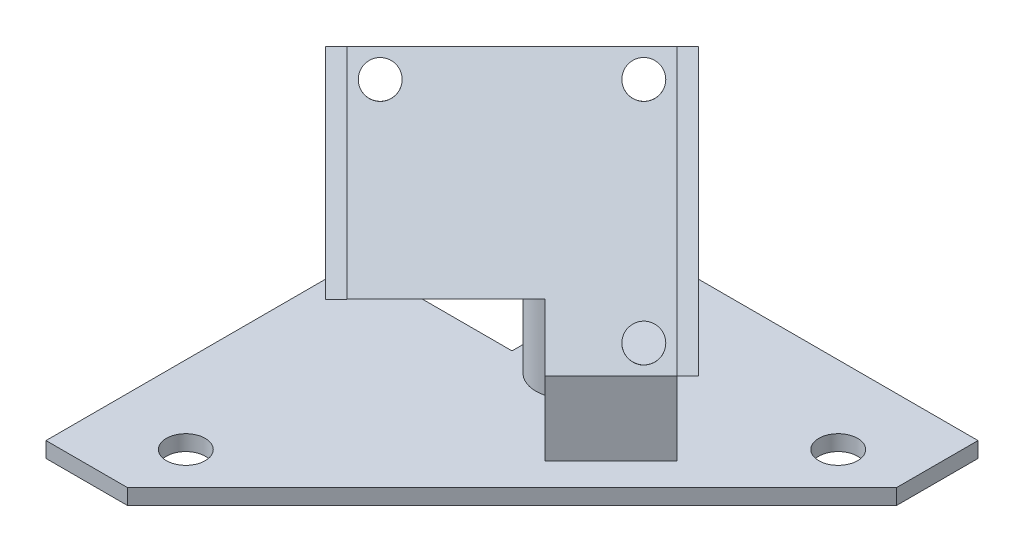
ISO-10303-21;
HEADER;
FILE_DESCRIPTION(('STEP AP214'),'2;1');
FILE_NAME('part.step','',(''),(''),'','','');
FILE_SCHEMA(('AUTOMOTIVE_DESIGN { 1 0 10303 214 1 1 1 1 }'));
ENDSEC;
DATA;
#1=APPLICATION_CONTEXT('core data for automotive mechanical design processes');
#2=APPLICATION_PROTOCOL_DEFINITION('international standard','automotive_design',2000,#1);
#3=PRODUCT_CONTEXT('',#1,'mechanical');
#4=PRODUCT('Part','Part','',(#3));
#5=PRODUCT_RELATED_PRODUCT_CATEGORY('part','',(#4));
#6=PRODUCT_DEFINITION_FORMATION('','',#4);
#7=PRODUCT_DEFINITION_CONTEXT('part definition',#1,'design');
#8=PRODUCT_DEFINITION('design','',#6,#7);
#9=PRODUCT_DEFINITION_SHAPE('','',#8);
#10=(LENGTH_UNIT() NAMED_UNIT(*) SI_UNIT(.MILLI.,.METRE.));
#11=(NAMED_UNIT(*) PLANE_ANGLE_UNIT() SI_UNIT($,.RADIAN.));
#12=(NAMED_UNIT(*) SI_UNIT($,.STERADIAN.) SOLID_ANGLE_UNIT());
#13=UNCERTAINTY_MEASURE_WITH_UNIT(LENGTH_MEASURE(1.E-05),#10,'distance_accuracy_value','');
#14=(GEOMETRIC_REPRESENTATION_CONTEXT(3) GLOBAL_UNCERTAINTY_ASSIGNED_CONTEXT((#13)) GLOBAL_UNIT_ASSIGNED_CONTEXT((#10,
#11,#12)) REPRESENTATION_CONTEXT('',''));
#15=CARTESIAN_POINT('',(0.,0.,0.));
#16=DIRECTION('',(0.,0.,1.));
#17=DIRECTION('',(1.,0.,0.));
#18=AXIS2_PLACEMENT_3D('',#15,#16,#17);
#19=CARTESIAN_POINT('',(36.083472955532,25.2282933289435,14.8702695199356));
#20=DIRECTION('',(-0.707106781186547,0.,0.707106781186548));
#21=DIRECTION('',(0.707106781186548,0.,0.707106781186547));
#22=AXIS2_PLACEMENT_3D('',#19,#20,#21);
#23=PLANE('',#22);
#24=DIRECTION('',(-0.57922796533957,-0.573576436351044,-0.57922796533957));
#25=VECTOR('',#24,1.);
#26=CARTESIAN_POINT('',(44.6292314178445,13.1987116803095,23.4160279822481));
#27=LINE('',#26,#25);
#28=CARTESIAN_POINT('',(42.8915475218258,11.4779823712564,21.6783440862294));
#29=VERTEX_POINT('',#28);
#30=CARTESIAN_POINT('',(41.7330915911467,10.3308294985543,20.5198881555502));
#31=VERTEX_POINT('',#30);
#32=EDGE_CURVE('E301',#29,#31,#27,.T.);
#33=ORIENTED_EDGE('',*,*,#32,.F.);
#34=DIRECTION('',(0.,-1.,0.));
#35=VECTOR('',#34,1.);
#36=CARTESIAN_POINT('',(42.8915475218258,500000.,21.6783440862294));
#37=LINE('',#36,#35);
#38=CARTESIAN_POINT('',(42.8915475218258,2.,21.6783440862294));
#39=VERTEX_POINT('',#38);
#40=EDGE_CURVE('E253',#29,#39,#37,.T.);
#41=ORIENTED_EDGE('',*,*,#40,.T.);
#42=DIRECTION('',(-0.707106781186548,0.,-0.707106781186548));
#43=VECTOR('',#42,1.);
#44=CARTESIAN_POINT('',(10.6066017177982,2.,-10.6066017177982));
#45=LINE('',#44,#43);
#46=CARTESIAN_POINT('',(41.7330915911467,2.,20.5198881555502));
#47=VERTEX_POINT('',#46);
#48=EDGE_CURVE('E258',#39,#47,#45,.T.);
#49=ORIENTED_EDGE('',*,*,#48,.T.);
#50=DIRECTION('',(0.,-1.,0.));
#51=VECTOR('',#50,1.);
#52=CARTESIAN_POINT('',(41.7330915911467,500000.,20.5198881555502));
#53=LINE('',#52,#51);
#54=EDGE_CURVE('E256',#31,#47,#53,.T.);
#55=ORIENTED_EDGE('',*,*,#54,.F.);
#56=EDGE_LOOP('',(#33,#41,#49,#55));
#57=FACE_BOUND('',#56,.T.);
#58=ADVANCED_FACE('F35',(#57),#23,.F.);
#59=CARTESIAN_POINT('',(0.,2.,0.));
#60=DIRECTION('',(0.,1.,0.));
#61=DIRECTION('',(0.,0.,1.));
#62=AXIS2_PLACEMENT_3D('',#59,#60,#61);
#63=PLANE('',#62);
#64=CARTESIAN_POINT('',(26.0301640550348,2.,18.9590962431693));
#65=DIRECTION('',(0.,1.,0.));
#66=DIRECTION('',(0.,0.,1.));
#67=AXIS2_PLACEMENT_3D('',#64,#65,#66);
#68=CIRCLE('',#67,4.);
#69=CARTESIAN_POINT('',(26.0301640550348,2.,22.9590962431693));
#70=VERTEX_POINT('',#69);
#71=EDGE_CURVE('E194',#70,#70,#68,.T.);
#72=ORIENTED_EDGE('',*,*,#71,.F.);
#73=EDGE_LOOP('',(#72));
#74=FACE_BOUND('',#73,.T.);
#75=CARTESIAN_POINT('',(52.,2.,10.));
#76=DIRECTION('',(0.,1.,0.));
#77=DIRECTION('',(0.,0.,1.));
#78=AXIS2_PLACEMENT_3D('',#75,#76,#77);
#79=CIRCLE('',#78,2.5);
#80=CARTESIAN_POINT('',(52.,2.,12.5));
#81=VERTEX_POINT('',#80);
#82=EDGE_CURVE('E162',#81,#81,#79,.T.);
#83=ORIENTED_EDGE('',*,*,#82,.F.);
#84=EDGE_LOOP('',(#83));
#85=FACE_BOUND('',#84,.T.);
#86=CARTESIAN_POINT('',(10.,2.,52.));
#87=DIRECTION('',(0.,1.,0.));
#88=DIRECTION('',(0.,0.,1.));
#89=AXIS2_PLACEMENT_3D('',#86,#87,#88);
#90=CIRCLE('',#89,2.5);
#91=CARTESIAN_POINT('',(10.,2.,54.5));
#92=VERTEX_POINT('',#91);
#93=EDGE_CURVE('E187',#92,#92,#90,.T.);
#94=ORIENTED_EDGE('',*,*,#93,.F.);
#95=EDGE_LOOP('',(#94));
#96=FACE_BOUND('',#95,.T.);
#97=DIRECTION('',(1.,0.,0.));
#98=VECTOR('',#97,1.);
#99=CARTESIAN_POINT('',(0.,2.,0.));
#100=LINE('',#99,#98);
#101=CARTESIAN_POINT('',(20.,2.,0.));
#102=VERTEX_POINT('',#101);
#103=CARTESIAN_POINT('',(60.,2.,0.));
#104=VERTEX_POINT('',#103);
#105=EDGE_CURVE('E183',#102,#104,#100,.T.);
#106=ORIENTED_EDGE('',*,*,#105,.F.);
#107=DIRECTION('',(0.,0.,1.));
#108=VECTOR('',#107,1.);
#109=CARTESIAN_POINT('',(20.,2.,0.));
#110=LINE('',#109,#108);
#111=CARTESIAN_POINT('',(20.,2.,20.));
#112=VERTEX_POINT('',#111);
#113=EDGE_CURVE('E181',#102,#112,#110,.T.);
#114=ORIENTED_EDGE('',*,*,#113,.T.);
#115=DIRECTION('',(1.,0.,0.));
#116=VECTOR('',#115,1.);
#117=CARTESIAN_POINT('',(0.,2.,20.));
#118=LINE('',#117,#116);
#119=CARTESIAN_POINT('',(0.,2.,20.));
#120=VERTEX_POINT('',#119);
#121=EDGE_CURVE('E172',#120,#112,#118,.T.);
#122=ORIENTED_EDGE('',*,*,#121,.F.);
#123=DIRECTION('',(0.,0.,1.));
#124=VECTOR('',#123,1.);
#125=CARTESIAN_POINT('',(0.,2.,0.));
#126=LINE('',#125,#124);
#127=CARTESIAN_POINT('',(0.,2.,60.));
#128=VERTEX_POINT('',#127);
#129=EDGE_CURVE('E117',#120,#128,#126,.T.);
#130=ORIENTED_EDGE('',*,*,#129,.T.);
#131=DIRECTION('',(1.,0.,0.));
#132=VECTOR('',#131,1.);
#133=CARTESIAN_POINT('',(0.,2.,60.));
#134=LINE('',#133,#132);
#135=CARTESIAN_POINT('',(10.5025253169417,2.,60.));
#136=VERTEX_POINT('',#135);
#137=EDGE_CURVE('E107',#128,#136,#134,.T.);
#138=ORIENTED_EDGE('',*,*,#137,.T.);
#139=DIRECTION('',(-0.707106781186548,0.,0.707106781186548));
#140=VECTOR('',#139,1.);
#141=CARTESIAN_POINT('',(35.2512626584708,2.,35.2512626584708));
#142=LINE('',#141,#140);
#143=CARTESIAN_POINT('',(60.,2.,10.5025253169417));
#144=VERTEX_POINT('',#143);
#145=EDGE_CURVE('E114',#144,#136,#142,.T.);
#146=ORIENTED_EDGE('',*,*,#145,.F.);
#147=DIRECTION('',(0.,0.,1.));
#148=VECTOR('',#147,1.);
#149=CARTESIAN_POINT('',(60.,2.,0.));
#150=LINE('',#149,#148);
#151=EDGE_CURVE('E133',#104,#144,#150,.T.);
#152=ORIENTED_EDGE('',*,*,#151,.F.);
#153=EDGE_LOOP('',(#106,#114,#122,#130,#138,#146,#152));
#154=FACE_BOUND('',#153,.T.);
#155=DIRECTION('',(-0.707106781186548,0.,0.707106781186547));
#156=VECTOR('',#155,1.);
#157=CARTESIAN_POINT('',(31.1264898733485,2.,31.1264898733485));
#158=LINE('',#157,#156);
#159=CARTESIAN_POINT('',(33.2478102169081,2.,29.0051695297888));
#160=VERTEX_POINT('',#159);
#161=EDGE_CURVE('E50',#47,#160,#158,.T.);
#162=ORIENTED_EDGE('',*,*,#161,.F.);
#163=ORIENTED_EDGE('',*,*,#48,.F.);
#164=DIRECTION('',(0.707106781186548,0.,-0.707106781186547));
#165=VECTOR('',#164,1.);
#166=CARTESIAN_POINT('',(32.2849458040276,2.,32.2849458040276));
#167=LINE('',#166,#165);
#168=CARTESIAN_POINT('',(34.4062661475873,2.,30.163625460468));
#169=VERTEX_POINT('',#168);
#170=EDGE_CURVE('E261',#169,#39,#167,.T.);
#171=ORIENTED_EDGE('',*,*,#170,.F.);
#172=DIRECTION('',(0.707106781186548,0.,0.707106781186548));
#173=VECTOR('',#172,1.);
#174=CARTESIAN_POINT('',(2.12132034355965,2.,-2.12132034355965));
#175=LINE('',#174,#173);
#176=EDGE_CURVE('E264',#160,#169,#175,.T.);
#177=ORIENTED_EDGE('',*,*,#176,.F.);
#178=EDGE_LOOP('',(#162,#163,#171,#177));
#179=FACE_BOUND('',#178,.T.);
#180=ADVANCED_FACE('F110',(#74,#85,#96,#154,#179),#63,.T.);
#181=CARTESIAN_POINT('',(0.,2.,0.));
#182=DIRECTION('',(0.,0.,-1.));
#183=DIRECTION('',(-1.,0.,0.));
#184=AXIS2_PLACEMENT_3D('',#181,#182,#183);
#185=PLANE('',#184);
#186=DIRECTION('',(1.,0.,0.));
#187=VECTOR('',#186,1.);
#188=CARTESIAN_POINT('',(0.,0.,0.));
#189=LINE('',#188,#187);
#190=CARTESIAN_POINT('',(20.,0.,0.));
#191=VERTEX_POINT('',#190);
#192=CARTESIAN_POINT('',(60.,0.,0.));
#193=VERTEX_POINT('',#192);
#194=EDGE_CURVE('E145',#191,#193,#189,.T.);
#195=ORIENTED_EDGE('',*,*,#194,.F.);
#196=DIRECTION('',(0.,-1.,0.));
#197=VECTOR('',#196,1.);
#198=CARTESIAN_POINT('',(20.,2.,0.));
#199=LINE('',#198,#197);
#200=EDGE_CURVE('E11',#102,#191,#199,.T.);
#201=ORIENTED_EDGE('',*,*,#200,.F.);
#202=ORIENTED_EDGE('',*,*,#105,.T.);
#203=DIRECTION('',(0.,-1.,0.));
#204=VECTOR('',#203,1.);
#205=CARTESIAN_POINT('',(60.,2.,0.));
#206=LINE('',#205,#204);
#207=EDGE_CURVE('E59',#104,#193,#206,.T.);
#208=ORIENTED_EDGE('',*,*,#207,.T.);
#209=EDGE_LOOP('',(#195,#201,#202,#208));
#210=FACE_BOUND('',#209,.T.);
#211=ADVANCED_FACE('F434',(#210),#185,.T.);
#212=CARTESIAN_POINT('',(20.,2.,0.));
#213=DIRECTION('',(1.,0.,0.));
#214=DIRECTION('',(0.,0.,-1.));
#215=AXIS2_PLACEMENT_3D('',#212,#213,#214);
#216=PLANE('',#215);
#217=DIRECTION('',(0.,0.,1.));
#218=VECTOR('',#217,1.);
#219=CARTESIAN_POINT('',(20.,0.,0.));
#220=LINE('',#219,#218);
#221=CARTESIAN_POINT('',(20.,0.,20.));
#222=VERTEX_POINT('',#221);
#223=EDGE_CURVE('E147',#191,#222,#220,.T.);
#224=ORIENTED_EDGE('',*,*,#223,.T.);
#225=DIRECTION('',(0.,-1.,0.));
#226=VECTOR('',#225,1.);
#227=CARTESIAN_POINT('',(20.,2.,20.));
#228=LINE('',#227,#226);
#229=EDGE_CURVE('E43',#112,#222,#228,.T.);
#230=ORIENTED_EDGE('',*,*,#229,.F.);
#231=ORIENTED_EDGE('',*,*,#113,.F.);
#232=ORIENTED_EDGE('',*,*,#200,.T.);
#233=EDGE_LOOP('',(#224,#230,#231,#232));
#234=FACE_BOUND('',#233,.T.);
#235=ADVANCED_FACE('F175',(#234),#216,.F.);
#236=CARTESIAN_POINT('',(0.,2.,20.));
#237=DIRECTION('',(0.,0.,-1.));
#238=DIRECTION('',(-1.,0.,0.));
#239=AXIS2_PLACEMENT_3D('',#236,#237,#238);
#240=PLANE('',#239);
#241=DIRECTION('',(1.,0.,0.));
#242=VECTOR('',#241,1.);
#243=CARTESIAN_POINT('',(0.,0.,20.));
#244=LINE('',#243,#242);
#245=CARTESIAN_POINT('',(0.,0.,20.));
#246=VERTEX_POINT('',#245);
#247=EDGE_CURVE('E150',#246,#222,#244,.T.);
#248=ORIENTED_EDGE('',*,*,#247,.F.);
#249=DIRECTION('',(0.,-1.,0.));
#250=VECTOR('',#249,1.);
#251=CARTESIAN_POINT('',(0.,2.,20.));
#252=LINE('',#251,#250);
#253=EDGE_CURVE('E166',#120,#246,#252,.T.);
#254=ORIENTED_EDGE('',*,*,#253,.F.);
#255=ORIENTED_EDGE('',*,*,#121,.T.);
#256=ORIENTED_EDGE('',*,*,#229,.T.);
#257=EDGE_LOOP('',(#248,#254,#255,#256));
#258=FACE_BOUND('',#257,.T.);
#259=ADVANCED_FACE('F171',(#258),#240,.T.);
#260=CARTESIAN_POINT('',(0.,2.,0.));
#261=DIRECTION('',(1.,0.,0.));
#262=DIRECTION('',(0.,0.,-1.));
#263=AXIS2_PLACEMENT_3D('',#260,#261,#262);
#264=PLANE('',#263);
#265=DIRECTION('',(0.,0.,1.));
#266=VECTOR('',#265,1.);
#267=CARTESIAN_POINT('',(0.,0.,0.));
#268=LINE('',#267,#266);
#269=CARTESIAN_POINT('',(0.,0.,60.));
#270=VERTEX_POINT('',#269);
#271=EDGE_CURVE('E153',#246,#270,#268,.T.);
#272=ORIENTED_EDGE('',*,*,#271,.T.);
#273=DIRECTION('',(0.,-1.,0.));
#274=VECTOR('',#273,1.);
#275=CARTESIAN_POINT('',(0.,2.,60.));
#276=LINE('',#275,#274);
#277=EDGE_CURVE('E129',#128,#270,#276,.T.);
#278=ORIENTED_EDGE('',*,*,#277,.F.);
#279=ORIENTED_EDGE('',*,*,#129,.F.);
#280=ORIENTED_EDGE('',*,*,#253,.T.);
#281=EDGE_LOOP('',(#272,#278,#279,#280));
#282=FACE_BOUND('',#281,.T.);
#283=ADVANCED_FACE('F180',(#282),#264,.F.);
#284=CARTESIAN_POINT('',(0.,2.,60.));
#285=DIRECTION('',(0.,0.,-1.));
#286=DIRECTION('',(-1.,0.,0.));
#287=AXIS2_PLACEMENT_3D('',#284,#285,#286);
#288=PLANE('',#287);
#289=DIRECTION('',(1.,0.,0.));
#290=VECTOR('',#289,1.);
#291=CARTESIAN_POINT('',(0.,0.,60.));
#292=LINE('',#291,#290);
#293=CARTESIAN_POINT('',(10.5025253169417,0.,60.));
#294=VERTEX_POINT('',#293);
#295=EDGE_CURVE('E125',#270,#294,#292,.T.);
#296=ORIENTED_EDGE('',*,*,#295,.T.);
#297=DIRECTION('',(0.,-1.,0.));
#298=VECTOR('',#297,1.);
#299=CARTESIAN_POINT('',(10.5025253169417,2.,60.));
#300=LINE('',#299,#298);
#301=EDGE_CURVE('E123',#136,#294,#300,.T.);
#302=ORIENTED_EDGE('',*,*,#301,.F.);
#303=ORIENTED_EDGE('',*,*,#137,.F.);
#304=ORIENTED_EDGE('',*,*,#277,.T.);
#305=EDGE_LOOP('',(#296,#302,#303,#304));
#306=FACE_BOUND('',#305,.T.);
#307=ADVANCED_FACE('F124',(#306),#288,.F.);
#308=CARTESIAN_POINT('',(35.2512626584708,2.,35.2512626584708));
#309=DIRECTION('',(0.707106781186547,0.,0.707106781186547));
#310=DIRECTION('',(0.707106781186548,0.,-0.707106781186548));
#311=AXIS2_PLACEMENT_3D('',#308,#309,#310);
#312=PLANE('',#311);
#313=DIRECTION('',(-0.707106781186548,0.,0.707106781186548));
#314=VECTOR('',#313,1.);
#315=CARTESIAN_POINT('',(35.2512626584708,0.,35.2512626584708));
#316=LINE('',#315,#314);
#317=CARTESIAN_POINT('',(60.,0.,10.5025253169417));
#318=VERTEX_POINT('',#317);
#319=EDGE_CURVE('E157',#318,#294,#316,.T.);
#320=ORIENTED_EDGE('',*,*,#319,.F.);
#321=DIRECTION('',(0.,-1.,0.));
#322=VECTOR('',#321,1.);
#323=CARTESIAN_POINT('',(60.,2.,10.5025253169417));
#324=LINE('',#323,#322);
#325=EDGE_CURVE('E130',#144,#318,#324,.T.);
#326=ORIENTED_EDGE('',*,*,#325,.F.);
#327=ORIENTED_EDGE('',*,*,#145,.T.);
#328=ORIENTED_EDGE('',*,*,#301,.T.);
#329=EDGE_LOOP('',(#320,#326,#327,#328));
#330=FACE_BOUND('',#329,.T.);
#331=ADVANCED_FACE('F132',(#330),#312,.T.);
#332=CARTESIAN_POINT('',(10.,2.,52.));
#333=DIRECTION('',(0.,-1.,0.));
#334=DIRECTION('',(0.,0.,-1.));
#335=AXIS2_PLACEMENT_3D('',#332,#333,#334);
#336=CYLINDRICAL_SURFACE('',#335,2.5);
#337=ORIENTED_EDGE('',*,*,#93,.T.);
#338=EDGE_LOOP('',(#337));
#339=FACE_BOUND('',#338,.T.);
#340=CARTESIAN_POINT('',(10.,0.,52.));
#341=DIRECTION('',(0.,1.,0.));
#342=DIRECTION('',(0.,0.,1.));
#343=AXIS2_PLACEMENT_3D('',#340,#341,#342);
#344=CIRCLE('',#343,2.5);
#345=CARTESIAN_POINT('',(10.,0.,54.5));
#346=VERTEX_POINT('',#345);
#347=EDGE_CURVE('E141',#346,#346,#344,.T.);
#348=ORIENTED_EDGE('',*,*,#347,.F.);
#349=EDGE_LOOP('',(#348));
#350=FACE_BOUND('',#349,.T.);
#351=ADVANCED_FACE('F457',(#339,#350),#336,.F.);
#352=CARTESIAN_POINT('',(52.,2.,10.));
#353=DIRECTION('',(0.,-1.,0.));
#354=DIRECTION('',(0.,0.,-1.));
#355=AXIS2_PLACEMENT_3D('',#352,#353,#354);
#356=CYLINDRICAL_SURFACE('',#355,2.5);
#357=ORIENTED_EDGE('',*,*,#82,.T.);
#358=EDGE_LOOP('',(#357));
#359=FACE_BOUND('',#358,.T.);
#360=CARTESIAN_POINT('',(52.,0.,10.));
#361=DIRECTION('',(0.,1.,0.));
#362=DIRECTION('',(0.,0.,1.));
#363=AXIS2_PLACEMENT_3D('',#360,#361,#362);
#364=CIRCLE('',#363,2.5);
#365=CARTESIAN_POINT('',(52.,0.,12.5));
#366=VERTEX_POINT('',#365);
#367=EDGE_CURVE('E138',#366,#366,#364,.T.);
#368=ORIENTED_EDGE('',*,*,#367,.F.);
#369=EDGE_LOOP('',(#368));
#370=FACE_BOUND('',#369,.T.);
#371=ADVANCED_FACE('F37',(#359,#370),#356,.F.);
#372=CARTESIAN_POINT('',(60.,2.,0.));
#373=DIRECTION('',(1.,0.,0.));
#374=DIRECTION('',(0.,0.,-1.));
#375=AXIS2_PLACEMENT_3D('',#372,#373,#374);
#376=PLANE('',#375);
#377=DIRECTION('',(0.,0.,1.));
#378=VECTOR('',#377,1.);
#379=CARTESIAN_POINT('',(60.,0.,0.));
#380=LINE('',#379,#378);
#381=EDGE_CURVE('E159',#193,#318,#380,.T.);
#382=ORIENTED_EDGE('',*,*,#381,.F.);
#383=ORIENTED_EDGE('',*,*,#207,.F.);
#384=ORIENTED_EDGE('',*,*,#151,.T.);
#385=ORIENTED_EDGE('',*,*,#325,.T.);
#386=EDGE_LOOP('',(#382,#383,#384,#385));
#387=FACE_BOUND('',#386,.T.);
#388=ADVANCED_FACE('F451',(#387),#376,.T.);
#389=CARTESIAN_POINT('',(0.,0.,0.));
#390=DIRECTION('',(0.,1.,0.));
#391=DIRECTION('',(0.,0.,1.));
#392=AXIS2_PLACEMENT_3D('',#389,#390,#391);
#393=PLANE('',#392);
#394=ORIENTED_EDGE('',*,*,#367,.T.);
#395=EDGE_LOOP('',(#394));
#396=FACE_BOUND('',#395,.T.);
#397=ORIENTED_EDGE('',*,*,#347,.T.);
#398=EDGE_LOOP('',(#397));
#399=FACE_BOUND('',#398,.T.);
#400=ORIENTED_EDGE('',*,*,#194,.T.);
#401=ORIENTED_EDGE('',*,*,#381,.T.);
#402=ORIENTED_EDGE('',*,*,#319,.T.);
#403=ORIENTED_EDGE('',*,*,#295,.F.);
#404=ORIENTED_EDGE('',*,*,#271,.F.);
#405=ORIENTED_EDGE('',*,*,#247,.T.);
#406=ORIENTED_EDGE('',*,*,#223,.F.);
#407=EDGE_LOOP('',(#400,#401,#402,#403,#404,#405,#406));
#408=FACE_BOUND('',#407,.T.);
#409=ADVANCED_FACE('F178',(#396,#399,#408),#393,.F.);
#410=CARTESIAN_POINT('',(26.0301640550348,43.283929457579,18.9590962431693));
#411=DIRECTION('',(0.,-1.,0.));
#412=DIRECTION('',(0.,0.,-1.));
#413=AXIS2_PLACEMENT_3D('',#410,#411,#412);
#414=CYLINDRICAL_SURFACE('',#413,4.);
#415=ORIENTED_EDGE('',*,*,#71,.T.);
#416=EDGE_LOOP('',(#415));
#417=FACE_BOUND('',#416,.T.);
#418=CARTESIAN_POINT('',(26.0301640550348,27.7646507935135,18.9590962431693));
#419=DIRECTION('',(0.57922796533957,0.573576436351044,0.57922796533957));
#420=DIRECTION('',(0.405579787672638,-0.819152044288993,0.405579787672638));
#421=AXIS2_PLACEMENT_3D('',#418,#419,#420);
#422=ELLIPSE('',#421,6.97378718248442,4.);
#423=CARTESIAN_POINT('',(28.858591179781,22.052058766545,21.7875233679155));
#424=VERTEX_POINT('',#423);
#425=EDGE_CURVE('E142',#424,#424,#422,.T.);
#426=ORIENTED_EDGE('',*,*,#425,.F.);
#427=EDGE_LOOP('',(#426));
#428=FACE_BOUND('',#427,.T.);
#429=ADVANCED_FACE('F447',(#417,#428),#414,.T.);
#430=CARTESIAN_POINT('',(27.5981915812934,25.2282933289435,23.3555508941741));
#431=DIRECTION('',(-0.707106781186547,0.,0.707106781186548));
#432=DIRECTION('',(0.707106781186548,0.,0.707106781186547));
#433=AXIS2_PLACEMENT_3D('',#430,#431,#432);
#434=PLANE('',#433);
#435=DIRECTION('',(-0.405579787672638,0.819152044288993,-0.405579787672637));
#436=VECTOR('',#435,1.);
#437=CARTESIAN_POINT('',(26.4397356506143,24.0811404562414,22.197094963495));
#438=LINE('',#437,#436);
#439=CARTESIAN_POINT('',(33.2478102169109,10.3308294985653,29.0051695297916));
#440=VERTEX_POINT('',#439);
#441=CARTESIAN_POINT('',(30.4087517031996,16.0648938085772,26.1661110160803));
#442=VERTEX_POINT('',#441);
#443=EDGE_CURVE('E217',#440,#442,#438,.T.);
#444=ORIENTED_EDGE('',*,*,#443,.F.);
#445=DIRECTION('',(0.,-1.,0.));
#446=VECTOR('',#445,1.);
#447=CARTESIAN_POINT('',(33.2478102169081,500000.,29.0051695297888));
#448=LINE('',#447,#446);
#449=EDGE_CURVE('E223',#440,#160,#448,.T.);
#450=ORIENTED_EDGE('',*,*,#449,.T.);
#451=ORIENTED_EDGE('',*,*,#176,.T.);
#452=DIRECTION('',(0.,-1.,0.));
#453=VECTOR('',#452,1.);
#454=CARTESIAN_POINT('',(34.4062661475873,500000.,30.163625460468));
#455=LINE('',#454,#453);
#456=CARTESIAN_POINT('',(34.4062661475873,11.4779823712564,30.163625460468));
#457=VERTEX_POINT('',#456);
#458=EDGE_CURVE('E250',#457,#169,#455,.T.);
#459=ORIENTED_EDGE('',*,*,#458,.F.);
#460=DIRECTION('',(-0.405579787672638,0.819152044288993,-0.405579787672637));
#461=VECTOR('',#460,1.);
#462=CARTESIAN_POINT('',(27.5981915812934,25.2282933289435,23.3555508941741));
#463=LINE('',#462,#461);
#464=CARTESIAN_POINT('',(31.5672076338788,17.2120466812793,27.3245669467595));
#465=VERTEX_POINT('',#464);
#466=EDGE_CURVE('E244',#457,#465,#463,.T.);
#467=ORIENTED_EDGE('',*,*,#466,.T.);
#468=DIRECTION('',(-0.57922796533957,-0.573576436351044,-0.57922796533957));
#469=VECTOR('',#468,1.);
#470=CARTESIAN_POINT('',(31.5672076338788,17.2120466812793,27.3245669467595));
#471=LINE('',#470,#469);
#472=EDGE_CURVE('E197',#465,#442,#471,.T.);
#473=ORIENTED_EDGE('',*,*,#472,.T.);
#474=EDGE_LOOP('',(#444,#450,#451,#459,#467,#473));
#475=FACE_BOUND('',#474,.T.);
#476=ADVANCED_FACE('F402',(#475),#434,.T.);
#477=CARTESIAN_POINT('',(20.1175521738485,36.0525436999262,20.1175521738485));
#478=DIRECTION('',(0.405579787672638,-0.819152044288993,0.405579787672638));
#479=DIRECTION('',(0.896169137511728,0.443712606279656,0.));
#480=AXIS2_PLACEMENT_3D('',#477,#478,#479);
#481=PLANE('',#480);
#482=DIRECTION('',(-0.707106781186547,0.,0.707106781186548));
#483=VECTOR('',#482,1.);
#484=CARTESIAN_POINT('',(18.9590962431693,34.9053908272241,18.9590962431693));
#485=LINE('',#484,#483);
#486=CARTESIAN_POINT('',(30.9799115233406,34.9053908272241,6.93828096299802));
#487=VERTEX_POINT('',#486);
#488=CARTESIAN_POINT('',(6.93828096299803,34.9053908272241,30.9799115233406));
#489=VERTEX_POINT('',#488);
#490=EDGE_CURVE('E211',#487,#489,#485,.T.);
#491=ORIENTED_EDGE('',*,*,#490,.T.);
#492=DIRECTION('',(-0.57922796533957,-0.573576436351044,-0.57922796533957));
#493=VECTOR('',#492,1.);
#494=CARTESIAN_POINT('',(9.83442078969587,37.7732730089793,33.8760513500385));
#495=LINE('',#494,#493);
#496=CARTESIAN_POINT('',(9.83442078969587,37.7732730089793,33.8760513500385));
#497=VERTEX_POINT('',#496);
#498=EDGE_CURVE('E268',#497,#489,#495,.T.);
#499=ORIENTED_EDGE('',*,*,#498,.F.);
#500=DIRECTION('',(-0.707106781186548,0.,0.707106781186548));
#501=VECTOR('',#500,1.);
#502=CARTESIAN_POINT('',(11.248634352069,37.7732730089793,32.4618377876654));
#503=LINE('',#502,#501);
#504=CARTESIAN_POINT('',(11.248634352069,37.7732730089793,32.4618377876654));
#505=VERTEX_POINT('',#504);
#506=EDGE_CURVE('E289',#505,#497,#503,.T.);
#507=ORIENTED_EDGE('',*,*,#506,.F.);
#508=DIRECTION('',(-0.57922796533957,-0.573576436351044,-0.57922796533957));
#509=VECTOR('',#508,1.);
#510=CARTESIAN_POINT('',(11.248634352069,37.7732730089793,32.4618377876654));
#511=LINE('',#510,#509);
#512=CARTESIAN_POINT('',(9.51095045605027,36.0525436999262,30.7241538916467));
#513=VERTEX_POINT('',#512);
#514=EDGE_CURVE('E277',#505,#513,#511,.T.);
#515=ORIENTED_EDGE('',*,*,#514,.T.);
#516=DIRECTION('',(-0.707106781186547,0.,0.707106781186548));
#517=VECTOR('',#516,1.);
#518=CARTESIAN_POINT('',(20.1175521738485,36.0525436999262,20.1175521738485));
#519=LINE('',#518,#517);
#520=CARTESIAN_POINT('',(30.7241538916467,36.0525436999262,9.51095045605025));
#521=VERTEX_POINT('',#520);
#522=EDGE_CURVE('E235',#521,#513,#519,.T.);
#523=ORIENTED_EDGE('',*,*,#522,.F.);
#524=DIRECTION('',(-0.57922796533957,-0.573576436351044,-0.57922796533957));
#525=VECTOR('',#524,1.);
#526=CARTESIAN_POINT('',(32.4618377876654,37.7732730089793,11.248634352069));
#527=LINE('',#526,#525);
#528=CARTESIAN_POINT('',(32.4618377876654,37.7732730089793,11.248634352069));
#529=VERTEX_POINT('',#528);
#530=EDGE_CURVE('E295',#529,#521,#527,.T.);
#531=ORIENTED_EDGE('',*,*,#530,.F.);
#532=DIRECTION('',(-0.707106781186546,0.,0.707106781186549));
#533=VECTOR('',#532,1.);
#534=CARTESIAN_POINT('',(32.4618377876654,37.7732730089793,11.248634352069));
#535=LINE('',#534,#533);
#536=CARTESIAN_POINT('',(33.8760513500385,37.7732730089793,9.83442078969586));
#537=VERTEX_POINT('',#536);
#538=EDGE_CURVE('E317',#537,#529,#535,.T.);
#539=ORIENTED_EDGE('',*,*,#538,.F.);
#540=DIRECTION('',(-0.57922796533957,-0.573576436351044,-0.57922796533957));
#541=VECTOR('',#540,1.);
#542=CARTESIAN_POINT('',(33.8760513500385,37.7732730089793,9.83442078969586));
#543=LINE('',#542,#541);
#544=EDGE_CURVE('E305',#537,#487,#543,.T.);
#545=ORIENTED_EDGE('',*,*,#544,.T.);
#546=EDGE_LOOP('',(#491,#499,#507,#515,#523,#531,#539,#545));
#547=FACE_BOUND('',#546,.T.);
#548=ADVANCED_FACE('F416',(#547),#481,.F.);
#549=CARTESIAN_POINT('',(12.8490101626278,33.5950875670592,29.819572911105));
#550=DIRECTION('',(-0.57922796533957,-0.573576436351044,-0.57922796533957));
#551=DIRECTION('',(-0.707106781186547,0.,0.707106781186548));
#552=AXIS2_PLACEMENT_3D('',#549,#550,#551);
#553=CYLINDRICAL_SURFACE('',#552,2.);
#554=CARTESIAN_POINT('',(12.8490101626278,33.5950875670592,29.819572911105));
#555=DIRECTION('',(0.57922796533957,0.573576436351044,0.57922796533957));
#556=DIRECTION('',(0.707106781186547,0.,-0.707106781186548));
#557=AXIS2_PLACEMENT_3D('',#554,#555,#556);
#558=CIRCLE('',#557,2.);
#559=CARTESIAN_POINT('',(14.2632237250009,33.5950875670592,28.4053593487319));
#560=VERTEX_POINT('',#559);
#561=EDGE_CURVE('E226',#560,#560,#558,.T.);
#562=ORIENTED_EDGE('',*,*,#561,.T.);
#563=EDGE_LOOP('',(#562));
#564=FACE_BOUND('',#563,.T.);
#565=CARTESIAN_POINT('',(11.6905542319487,32.4479346943571,28.6611169804258));
#566=DIRECTION('',(0.57922796533957,0.573576436351044,0.57922796533957));
#567=DIRECTION('',(0.707106781186547,0.,-0.707106781186548));
#568=AXIS2_PLACEMENT_3D('',#565,#566,#567);
#569=CIRCLE('',#568,2.);
#570=CARTESIAN_POINT('',(13.1047677943218,32.4479346943571,27.2469034180527));
#571=VERTEX_POINT('',#570);
#572=EDGE_CURVE('E205',#571,#571,#569,.T.);
#573=ORIENTED_EDGE('',*,*,#572,.F.);
#574=EDGE_LOOP('',(#573));
#575=FACE_BOUND('',#574,.T.);
#576=ADVANCED_FACE('F509',(#564,#575),#553,.F.);
#577=CARTESIAN_POINT('',(29.4458872903191,17.2120466812793,29.4458872903191));
#578=DIRECTION('',(-0.405579787672638,0.819152044288993,-0.405579787672637));
#579=DIRECTION('',(-0.896169137511728,-0.443712606279657,0.));
#580=AXIS2_PLACEMENT_3D('',#577,#578,#579);
#581=PLANE('',#580);
#582=DIRECTION('',(0.707106781186547,0.,-0.707106781186548));
#583=VECTOR('',#582,1.);
#584=CARTESIAN_POINT('',(28.28743135964,16.0648938085772,28.28743135964));
#585=LINE('',#584,#583);
#586=CARTESIAN_POINT('',(16.2666160794687,16.0648938085772,40.3082466398113));
#587=VERTEX_POINT('',#586);
#588=EDGE_CURVE('E208',#587,#442,#585,.T.);
#589=ORIENTED_EDGE('',*,*,#588,.T.);
#590=ORIENTED_EDGE('',*,*,#472,.F.);
#591=DIRECTION('',(0.707106781186547,0.,-0.707106781186548));
#592=VECTOR('',#591,1.);
#593=CARTESIAN_POINT('',(29.4458872903191,17.2120466812793,29.4458872903191));
#594=LINE('',#593,#592);
#595=CARTESIAN_POINT('',(18.8392855725209,17.2120466812793,40.0524890081174));
#596=VERTEX_POINT('',#595);
#597=EDGE_CURVE('E229',#596,#465,#594,.T.);
#598=ORIENTED_EDGE('',*,*,#597,.F.);
#599=DIRECTION('',(-0.57922796533957,-0.573576436351044,-0.57922796533957));
#600=VECTOR('',#599,1.);
#601=CARTESIAN_POINT('',(20.5769694685396,18.9327759903324,41.7901729041361));
#602=LINE('',#601,#600);
#603=CARTESIAN_POINT('',(20.5769694685396,18.9327759903324,41.7901729041361));
#604=VERTEX_POINT('',#603);
#605=EDGE_CURVE('E274',#604,#596,#602,.T.);
#606=ORIENTED_EDGE('',*,*,#605,.F.);
#607=DIRECTION('',(0.707106781186549,0.,-0.707106781186546));
#608=VECTOR('',#607,1.);
#609=CARTESIAN_POINT('',(20.5769694685396,18.9327759903324,41.7901729041361));
#610=LINE('',#609,#608);
#611=CARTESIAN_POINT('',(19.1627559061666,18.9327759903325,43.2043864665091));
#612=VERTEX_POINT('',#611);
#613=EDGE_CURVE('E283',#612,#604,#610,.T.);
#614=ORIENTED_EDGE('',*,*,#613,.F.);
#615=DIRECTION('',(-0.57922796533957,-0.573576436351044,-0.57922796533957));
#616=VECTOR('',#615,1.);
#617=CARTESIAN_POINT('',(19.1627559061666,18.9327759903325,43.2043864665091));
#618=LINE('',#617,#616);
#619=EDGE_CURVE('E271',#612,#587,#618,.T.);
#620=ORIENTED_EDGE('',*,*,#619,.T.);
#621=EDGE_LOOP('',(#589,#590,#598,#606,#614,#620));
#622=FACE_BOUND('',#621,.T.);
#623=ADVANCED_FACE('F399',(#622),#581,.F.);
#624=CARTESIAN_POINT('',(39.5534878152483,13.9354385041234,22.5829250667711));
#625=DIRECTION('',(-0.57922796533957,-0.573576436351044,-0.57922796533957));
#626=DIRECTION('',(-0.707106781186547,0.,0.707106781186548));
#627=AXIS2_PLACEMENT_3D('',#624,#625,#626);
#628=CYLINDRICAL_SURFACE('',#627,1.99999999999999);
#629=CARTESIAN_POINT('',(39.5534878152483,13.9354385041234,22.5829250667711));
#630=DIRECTION('',(0.57922796533957,0.573576436351044,0.57922796533957));
#631=DIRECTION('',(0.707106781186547,0.,-0.707106781186548));
#632=AXIS2_PLACEMENT_3D('',#629,#630,#631);
#633=CIRCLE('',#632,1.99999999999999);
#634=CARTESIAN_POINT('',(40.9677013776214,13.9354385041234,21.168711504398));
#635=VERTEX_POINT('',#634);
#636=EDGE_CURVE('E204',#635,#635,#633,.T.);
#637=ORIENTED_EDGE('',*,*,#636,.T.);
#638=EDGE_LOOP('',(#637));
#639=FACE_BOUND('',#638,.T.);
#640=CARTESIAN_POINT('',(38.3950318845691,12.7882856314213,21.424469136092));
#641=DIRECTION('',(0.57922796533957,0.573576436351044,0.57922796533957));
#642=DIRECTION('',(0.707106781186547,0.,-0.707106781186548));
#643=AXIS2_PLACEMENT_3D('',#640,#641,#642);
#644=CIRCLE('',#643,1.99999999999999);
#645=CARTESIAN_POINT('',(39.8092454469422,12.7882856314213,20.0102555737189));
#646=VERTEX_POINT('',#645);
#647=EDGE_CURVE('E220',#646,#646,#644,.T.);
#648=ORIENTED_EDGE('',*,*,#647,.F.);
#649=EDGE_LOOP('',(#648));
#650=FACE_BOUND('',#649,.T.);
#651=ADVANCED_FACE('F523',(#639,#650),#628,.F.);
#652=CARTESIAN_POINT('',(29.819572911105,33.5950875670592,12.8490101626278));
#653=DIRECTION('',(-0.57922796533957,-0.573576436351044,-0.57922796533957));
#654=DIRECTION('',(-0.707106781186547,0.,0.707106781186548));
#655=AXIS2_PLACEMENT_3D('',#652,#653,#654);
#656=CYLINDRICAL_SURFACE('',#655,2.);
#657=CARTESIAN_POINT('',(29.819572911105,33.5950875670592,12.8490101626278));
#658=DIRECTION('',(0.57922796533957,0.573576436351044,0.57922796533957));
#659=DIRECTION('',(0.707106781186547,0.,-0.707106781186548));
#660=AXIS2_PLACEMENT_3D('',#657,#658,#659);
#661=CIRCLE('',#660,2.);
#662=CARTESIAN_POINT('',(31.2337864734781,33.5950875670592,11.4347966002547));
#663=VERTEX_POINT('',#662);
#664=EDGE_CURVE('E200',#663,#663,#661,.F.);
#665=ORIENTED_EDGE('',*,*,#664,.F.);
#666=EDGE_LOOP('',(#665));
#667=FACE_BOUND('',#666,.T.);
#668=CARTESIAN_POINT('',(28.6611169804258,32.4479346943571,11.6905542319487));
#669=DIRECTION('',(0.57922796533957,0.573576436351044,0.57922796533957));
#670=DIRECTION('',(0.707106781186547,0.,-0.707106781186548));
#671=AXIS2_PLACEMENT_3D('',#668,#669,#670);
#672=CIRCLE('',#671,2.);
#673=CARTESIAN_POINT('',(30.0753305427989,32.4479346943571,10.2763406695756));
#674=VERTEX_POINT('',#673);
#675=EDGE_CURVE('E201',#674,#674,#672,.F.);
#676=ORIENTED_EDGE('',*,*,#675,.T.);
#677=EDGE_LOOP('',(#676));
#678=FACE_BOUND('',#677,.T.);
#679=ADVANCED_FACE('F530',(#667,#678),#656,.F.);
#680=CARTESIAN_POINT('',(25.4768712377338,25.2282933289435,25.4768712377338));
#681=DIRECTION('',(0.57922796533957,0.573576436351044,0.57922796533957));
#682=DIRECTION('',(0.707106781186547,0.,-0.707106781186548));
#683=AXIS2_PLACEMENT_3D('',#680,#681,#682);
#684=PLANE('',#683);
#685=ORIENTED_EDGE('',*,*,#636,.F.);
#686=EDGE_LOOP('',(#685));
#687=FACE_BOUND('',#686,.T.);
#688=ORIENTED_EDGE('',*,*,#466,.F.);
#689=DIRECTION('',(-0.707106781186547,0.,0.707106781186548));
#690=VECTOR('',#689,1.);
#691=CARTESIAN_POINT('',(32.2849458040276,11.4779823712564,32.2849458040276));
#692=LINE('',#691,#690);
#693=EDGE_CURVE('E241',#29,#457,#692,.T.);
#694=ORIENTED_EDGE('',*,*,#693,.F.);
#695=DIRECTION('',(-0.405579787672638,0.819152044288993,-0.405579787672638));
#696=VECTOR('',#695,1.);
#697=CARTESIAN_POINT('',(36.083472955532,25.2282933289435,14.8702695199356));
#698=LINE('',#697,#696);
#699=EDGE_CURVE('E238',#29,#521,#698,.T.);
#700=ORIENTED_EDGE('',*,*,#699,.T.);
#701=ORIENTED_EDGE('',*,*,#522,.T.);
#702=DIRECTION('',(-0.405579787672638,0.819152044288993,-0.405579787672638));
#703=VECTOR('',#702,1.);
#704=CARTESIAN_POINT('',(14.8702695199356,25.2282933289435,36.083472955532));
#705=LINE('',#704,#703);
#706=EDGE_CURVE('E232',#596,#513,#705,.T.);
#707=ORIENTED_EDGE('',*,*,#706,.F.);
#708=ORIENTED_EDGE('',*,*,#597,.T.);
#709=EDGE_LOOP('',(#688,#694,#700,#701,#707,#708));
#710=FACE_BOUND('',#709,.T.);
#711=ORIENTED_EDGE('',*,*,#561,.F.);
#712=EDGE_LOOP('',(#711));
#713=FACE_BOUND('',#712,.T.);
#714=ORIENTED_EDGE('',*,*,#664,.T.);
#715=EDGE_LOOP('',(#714));
#716=FACE_BOUND('',#715,.T.);
#717=ADVANCED_FACE('F394',(#687,#710,#713,#716),#684,.T.);
#718=CARTESIAN_POINT('',(24.3184153070547,24.0811404562414,24.3184153070546));
#719=DIRECTION('',(0.57922796533957,0.573576436351044,0.57922796533957));
#720=DIRECTION('',(0.707106781186547,0.,-0.707106781186548));
#721=AXIS2_PLACEMENT_3D('',#718,#719,#720);
#722=PLANE('',#721);
#723=ORIENTED_EDGE('',*,*,#425,.T.);
#724=EDGE_LOOP('',(#723));
#725=FACE_BOUND('',#724,.T.);
#726=ORIENTED_EDGE('',*,*,#647,.T.);
#727=EDGE_LOOP('',(#726));
#728=FACE_BOUND('',#727,.T.);
#729=ORIENTED_EDGE('',*,*,#443,.T.);
#730=ORIENTED_EDGE('',*,*,#588,.F.);
#731=DIRECTION('',(-0.405579787672638,0.819152044288993,-0.405579787672637));
#732=VECTOR('',#731,1.);
#733=CARTESIAN_POINT('',(6.93828096299803,34.9053908272241,30.9799115233406));
#734=LINE('',#733,#732);
#735=EDGE_CURVE('E292',#587,#489,#734,.T.);
#736=ORIENTED_EDGE('',*,*,#735,.T.);
#737=ORIENTED_EDGE('',*,*,#490,.F.);
#738=DIRECTION('',(0.405579787672638,-0.819152044288993,0.405579787672637));
#739=VECTOR('',#738,1.);
#740=CARTESIAN_POINT('',(30.9799115233406,34.9053908272241,6.93828096299801));
#741=LINE('',#740,#739);
#742=CARTESIAN_POINT('',(43.1473051535198,10.3308294985543,19.1056745931771));
#743=VERTEX_POINT('',#742);
#744=EDGE_CURVE('E320',#487,#743,#741,.T.);
#745=ORIENTED_EDGE('',*,*,#744,.T.);
#746=DIRECTION('',(-0.707106781186547,0.,0.707106781186548));
#747=VECTOR('',#746,1.);
#748=CARTESIAN_POINT('',(41.7330915911467,10.3308294985543,20.5198881555502));
#749=LINE('',#748,#747);
#750=EDGE_CURVE('E323',#743,#31,#749,.T.);
#751=ORIENTED_EDGE('',*,*,#750,.T.);
#752=DIRECTION('',(-0.707106781186547,0.,0.707106781186548));
#753=VECTOR('',#752,1.);
#754=CARTESIAN_POINT('',(31.1264898733485,10.3308294985543,31.1264898733485));
#755=LINE('',#754,#753);
#756=EDGE_CURVE('E214',#31,#440,#755,.T.);
#757=ORIENTED_EDGE('',*,*,#756,.T.);
#758=EDGE_LOOP('',(#729,#730,#736,#737,#745,#751,#757));
#759=FACE_BOUND('',#758,.T.);
#760=ORIENTED_EDGE('',*,*,#572,.T.);
#761=EDGE_LOOP('',(#760));
#762=FACE_BOUND('',#761,.T.);
#763=ORIENTED_EDGE('',*,*,#675,.F.);
#764=EDGE_LOOP('',(#763));
#765=FACE_BOUND('',#764,.T.);
#766=ADVANCED_FACE('F328',(#725,#728,#759,#762,#765),#722,.F.);
#767=CARTESIAN_POINT('',(31.1264898733485,500000.,31.1264898733485));
#768=DIRECTION('',(0.707106781186547,0.,0.707106781186548));
#769=DIRECTION('',(0.707106781186548,0.,-0.707106781186547));
#770=AXIS2_PLACEMENT_3D('',#767,#768,#769);
#771=PLANE('',#770);
#772=ORIENTED_EDGE('',*,*,#756,.F.);
#773=ORIENTED_EDGE('',*,*,#54,.T.);
#774=ORIENTED_EDGE('',*,*,#161,.T.);
#775=ORIENTED_EDGE('',*,*,#449,.F.);
#776=EDGE_LOOP('',(#772,#773,#774,#775));
#777=FACE_BOUND('',#776,.T.);
#778=ADVANCED_FACE('F430',(#777),#771,.F.);
#779=CARTESIAN_POINT('',(32.2849458040276,500000.,32.2849458040276));
#780=DIRECTION('',(-0.707106781186547,0.,-0.707106781186548));
#781=DIRECTION('',(-0.707106781186548,0.,0.707106781186547));
#782=AXIS2_PLACEMENT_3D('',#779,#780,#781);
#783=PLANE('',#782);
#784=ORIENTED_EDGE('',*,*,#40,.F.);
#785=ORIENTED_EDGE('',*,*,#693,.T.);
#786=ORIENTED_EDGE('',*,*,#458,.T.);
#787=ORIENTED_EDGE('',*,*,#170,.T.);
#788=EDGE_LOOP('',(#784,#785,#786,#787));
#789=FACE_BOUND('',#788,.T.);
#790=ADVANCED_FACE('F407',(#789),#783,.F.);
#791=CARTESIAN_POINT('',(9.83442078969587,37.7732730089793,33.8760513500385));
#792=DIRECTION('',(0.707106781186547,0.,-0.707106781186548));
#793=DIRECTION('',(-0.707106781186548,0.,-0.707106781186547));
#794=AXIS2_PLACEMENT_3D('',#791,#792,#793);
#795=PLANE('',#794);
#796=ORIENTED_EDGE('',*,*,#498,.T.);
#797=ORIENTED_EDGE('',*,*,#735,.F.);
#798=ORIENTED_EDGE('',*,*,#619,.F.);
#799=DIRECTION('',(0.405579787672638,-0.819152044288993,0.405579787672637));
#800=VECTOR('',#799,1.);
#801=CARTESIAN_POINT('',(9.83442078969587,37.7732730089793,33.8760513500385));
#802=LINE('',#801,#800);
#803=EDGE_CURVE('E286',#497,#612,#802,.T.);
#804=ORIENTED_EDGE('',*,*,#803,.F.);
#805=EDGE_LOOP('',(#796,#797,#798,#804));
#806=FACE_BOUND('',#805,.T.);
#807=ADVANCED_FACE('F429',(#806),#795,.F.);
#808=CARTESIAN_POINT('',(11.248634352069,37.7732730089793,32.4618377876654));
#809=DIRECTION('',(-0.707106781186548,0.,0.707106781186547));
#810=DIRECTION('',(0.707106781186547,0.,0.707106781186548));
#811=AXIS2_PLACEMENT_3D('',#808,#809,#810);
#812=PLANE('',#811);
#813=ORIENTED_EDGE('',*,*,#706,.T.);
#814=ORIENTED_EDGE('',*,*,#514,.F.);
#815=DIRECTION('',(-0.405579787672637,0.819152044288993,-0.405579787672638));
#816=VECTOR('',#815,1.);
#817=CARTESIAN_POINT('',(11.248634352069,37.7732730089793,32.4618377876654));
#818=LINE('',#817,#816);
#819=EDGE_CURVE('E280',#604,#505,#818,.T.);
#820=ORIENTED_EDGE('',*,*,#819,.F.);
#821=ORIENTED_EDGE('',*,*,#605,.T.);
#822=EDGE_LOOP('',(#813,#814,#820,#821));
#823=FACE_BOUND('',#822,.T.);
#824=ADVANCED_FACE('F422',(#823),#812,.F.);
#825=CARTESIAN_POINT('',(27.2145551337525,26.9490226379966,27.2145551337525));
#826=DIRECTION('',(0.57922796533957,0.573576436351044,0.57922796533957));
#827=DIRECTION('',(0.707106781186548,0.,-0.707106781186548));
#828=AXIS2_PLACEMENT_3D('',#825,#826,#827);
#829=PLANE('',#828);
#830=ORIENTED_EDGE('',*,*,#506,.T.);
#831=ORIENTED_EDGE('',*,*,#803,.T.);
#832=ORIENTED_EDGE('',*,*,#613,.T.);
#833=ORIENTED_EDGE('',*,*,#819,.T.);
#834=EDGE_LOOP('',(#830,#831,#832,#833));
#835=FACE_BOUND('',#834,.T.);
#836=ADVANCED_FACE('F427',(#835),#829,.T.);
#837=CARTESIAN_POINT('',(32.4618377876654,37.7732730089793,11.248634352069));
#838=DIRECTION('',(0.707106781186547,0.,-0.707106781186548));
#839=DIRECTION('',(-0.707106781186548,0.,-0.707106781186547));
#840=AXIS2_PLACEMENT_3D('',#837,#838,#839);
#841=PLANE('',#840);
#842=ORIENTED_EDGE('',*,*,#699,.F.);
#843=CARTESIAN_POINT('',(44.6292314178445,13.1987116803095,23.4160279822481));
#844=VERTEX_POINT('',#843);
#845=EDGE_CURVE('E298',#844,#29,#27,.T.);
#846=ORIENTED_EDGE('',*,*,#845,.F.);
#847=DIRECTION('',(0.405579787672638,-0.819152044288993,0.405579787672637));
#848=VECTOR('',#847,1.);
#849=CARTESIAN_POINT('',(32.4618377876654,37.7732730089793,11.248634352069));
#850=LINE('',#849,#848);
#851=EDGE_CURVE('E314',#529,#844,#850,.T.);
#852=ORIENTED_EDGE('',*,*,#851,.F.);
#853=ORIENTED_EDGE('',*,*,#530,.T.);
#854=EDGE_LOOP('',(#842,#846,#852,#853));
#855=FACE_BOUND('',#854,.T.);
#856=ADVANCED_FACE('F413',(#855),#841,.F.);
#857=CARTESIAN_POINT('',(44.6292314178445,13.1987116803095,23.4160279822481));
#858=DIRECTION('',(-0.405579787672639,0.819152044288993,-0.405579787672637));
#859=DIRECTION('',(-0.896169137511728,-0.443712606279657,0.));
#860=AXIS2_PLACEMENT_3D('',#857,#858,#859);
#861=PLANE('',#860);
#862=ORIENTED_EDGE('',*,*,#845,.T.);
#863=ORIENTED_EDGE('',*,*,#32,.T.);
#864=ORIENTED_EDGE('',*,*,#750,.F.);
#865=DIRECTION('',(-0.57922796533957,-0.573576436351044,-0.57922796533957));
#866=VECTOR('',#865,1.);
#867=CARTESIAN_POINT('',(46.0434449802176,13.1987116803095,22.001814419875));
#868=LINE('',#867,#866);
#869=CARTESIAN_POINT('',(46.0434449802176,13.1987116803095,22.001814419875));
#870=VERTEX_POINT('',#869);
#871=EDGE_CURVE('E302',#870,#743,#868,.T.);
#872=ORIENTED_EDGE('',*,*,#871,.F.);
#873=DIRECTION('',(0.707106781186548,0.,-0.707106781186548));
#874=VECTOR('',#873,1.);
#875=CARTESIAN_POINT('',(44.6292314178445,13.1987116803095,23.4160279822481));
#876=LINE('',#875,#874);
#877=EDGE_CURVE('E311',#844,#870,#876,.T.);
#878=ORIENTED_EDGE('',*,*,#877,.F.);
#879=EDGE_LOOP('',(#862,#863,#864,#872,#878));
#880=FACE_BOUND('',#879,.T.);
#881=ADVANCED_FACE('F339',(#880),#861,.F.);
#882=CARTESIAN_POINT('',(33.8760513500385,37.7732730089793,9.83442078969586));
#883=DIRECTION('',(-0.707106781186547,0.,0.707106781186548));
#884=DIRECTION('',(0.707106781186548,0.,0.707106781186547));
#885=AXIS2_PLACEMENT_3D('',#882,#883,#884);
#886=PLANE('',#885);
#887=ORIENTED_EDGE('',*,*,#871,.T.);
#888=ORIENTED_EDGE('',*,*,#744,.F.);
#889=ORIENTED_EDGE('',*,*,#544,.F.);
#890=DIRECTION('',(-0.405579787672638,0.819152044288993,-0.405579787672637));
#891=VECTOR('',#890,1.);
#892=CARTESIAN_POINT('',(33.8760513500385,37.7732730089793,9.83442078969586));
#893=LINE('',#892,#891);
#894=EDGE_CURVE('E308',#870,#537,#893,.T.);
#895=ORIENTED_EDGE('',*,*,#894,.F.);
#896=EDGE_LOOP('',(#887,#888,#889,#895));
#897=FACE_BOUND('',#896,.T.);
#898=ADVANCED_FACE('F593',(#897),#886,.F.);
#899=CARTESIAN_POINT('',(27.2145551337525,26.9490226379966,27.2145551337525));
#900=DIRECTION('',(-0.57922796533957,-0.573576436351044,-0.57922796533957));
#901=DIRECTION('',(-0.707106781186548,0.,0.707106781186547));
#902=AXIS2_PLACEMENT_3D('',#899,#900,#901);
#903=PLANE('',#902);
#904=ORIENTED_EDGE('',*,*,#538,.T.);
#905=ORIENTED_EDGE('',*,*,#851,.T.);
#906=ORIENTED_EDGE('',*,*,#877,.T.);
#907=ORIENTED_EDGE('',*,*,#894,.T.);
#908=EDGE_LOOP('',(#904,#905,#906,#907));
#909=FACE_BOUND('',#908,.T.);
#910=ADVANCED_FACE('F600',(#909),#903,.F.);
#911=CLOSED_SHELL('',(#58,#180,#211,#235,#259,#283,#307,#331,#351,#371,#388,#409,#429,#476,#548,
#576,#623,#651,#679,#717,#766,#778,#790,#807,#824,#836,#856,#881,#898,#910));
#912=MANIFOLD_SOLID_BREP('B2',#911);
#913=ADVANCED_BREP_SHAPE_REPRESENTATION('',(#18,#912),#14);
#914=SHAPE_DEFINITION_REPRESENTATION(#9,#913);
ENDSEC;
END-ISO-10303-21;
